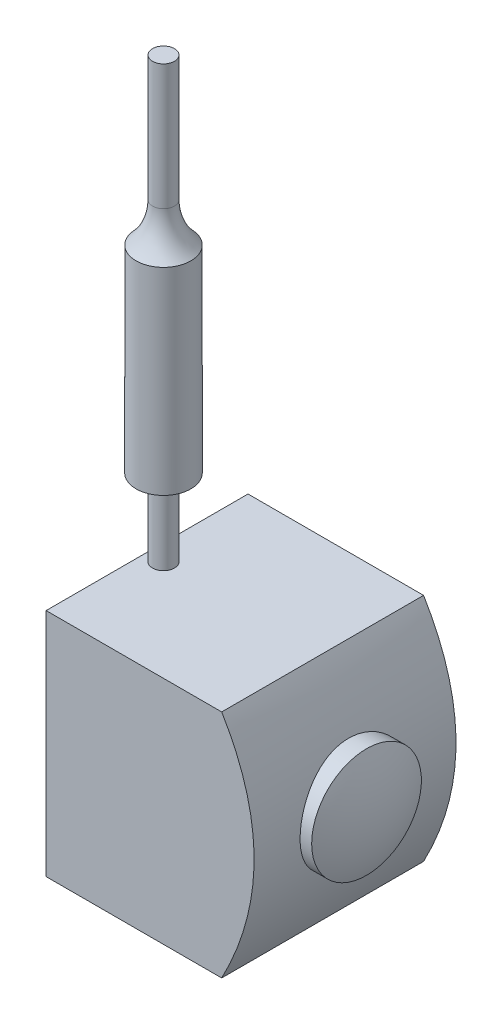
ISO-10303-21;
HEADER;
FILE_DESCRIPTION(('STEP AP214'),'2;1');
FILE_NAME('part.step','',(''),(''),'','','');
FILE_SCHEMA(('AUTOMOTIVE_DESIGN { 1 0 10303 214 1 1 1 1 }'));
ENDSEC;
DATA;
#1=APPLICATION_CONTEXT('core data for automotive mechanical design processes');
#2=APPLICATION_PROTOCOL_DEFINITION('international standard','automotive_design',2000,#1);
#3=PRODUCT_CONTEXT('',#1,'mechanical');
#4=PRODUCT('Part','Part','',(#3));
#5=PRODUCT_RELATED_PRODUCT_CATEGORY('part','',(#4));
#6=PRODUCT_DEFINITION_FORMATION('','',#4);
#7=PRODUCT_DEFINITION_CONTEXT('part definition',#1,'design');
#8=PRODUCT_DEFINITION('design','',#6,#7);
#9=PRODUCT_DEFINITION_SHAPE('','',#8);
#10=(LENGTH_UNIT() NAMED_UNIT(*) SI_UNIT(.MILLI.,.METRE.));
#11=(NAMED_UNIT(*) PLANE_ANGLE_UNIT() SI_UNIT($,.RADIAN.));
#12=(NAMED_UNIT(*) SI_UNIT($,.STERADIAN.) SOLID_ANGLE_UNIT());
#13=UNCERTAINTY_MEASURE_WITH_UNIT(LENGTH_MEASURE(1.E-05),#10,'distance_accuracy_value','');
#14=(GEOMETRIC_REPRESENTATION_CONTEXT(3) GLOBAL_UNCERTAINTY_ASSIGNED_CONTEXT((#13)) GLOBAL_UNIT_ASSIGNED_CONTEXT((#10,
#11,#12)) REPRESENTATION_CONTEXT('',''));
#15=CARTESIAN_POINT('',(0.,0.,0.));
#16=DIRECTION('',(0.,0.,1.));
#17=DIRECTION('',(1.,0.,0.));
#18=AXIS2_PLACEMENT_3D('',#15,#16,#17);
#19=CARTESIAN_POINT('',(-16.0675074987502,49.911673050458,9.2));
#20=DIRECTION('',(0.,-1.,0.));
#21=DIRECTION('',(0.,0.,-1.));
#22=AXIS2_PLACEMENT_3D('',#19,#20,#21);
#23=CYLINDRICAL_SURFACE('',#22,1.);
#24=CARTESIAN_POINT('',(-16.0675074987502,9.91167305045797,9.2));
#25=DIRECTION('',(0.,-1.,0.));
#26=DIRECTION('',(0.,0.,-1.));
#27=AXIS2_PLACEMENT_3D('',#24,#25,#26);
#28=CIRCLE('',#27,1.);
#29=CARTESIAN_POINT('',(-16.0675074987502,9.91167305045797,8.2));
#30=VERTEX_POINT('',#29);
#31=EDGE_CURVE('E183',#30,#30,#28,.F.);
#32=ORIENTED_EDGE('',*,*,#31,.T.);
#33=EDGE_LOOP('',(#32));
#34=FACE_BOUND('',#33,.T.);
#35=CARTESIAN_POINT('',(-16.0675074987502,16.911673050458,9.2));
#36=DIRECTION('',(0.,1.,0.));
#37=DIRECTION('',(0.,0.,1.));
#38=AXIS2_PLACEMENT_3D('',#35,#36,#37);
#39=CIRCLE('',#38,1.);
#40=CARTESIAN_POINT('',(-16.0675074987502,16.911673050458,10.2));
#41=VERTEX_POINT('',#40);
#42=EDGE_CURVE('E42',#41,#41,#39,.T.);
#43=ORIENTED_EDGE('',*,*,#42,.F.);
#44=EDGE_LOOP('',(#43));
#45=FACE_BOUND('',#44,.T.);
#46=ADVANCED_FACE('F33',(#34,#45),#23,.T.);
#47=CARTESIAN_POINT('',(-17.5638837182943,9.91167305045797,18.4));
#48=DIRECTION('',(1.,0.,0.));
#49=DIRECTION('',(0.,0.,-1.));
#50=AXIS2_PLACEMENT_3D('',#47,#48,#49);
#51=PLANE('',#50);
#52=DIRECTION('',(0.,-1.,0.));
#53=VECTOR('',#52,1.);
#54=CARTESIAN_POINT('',(-17.5638837182943,9.91167305045797,0.));
#55=LINE('',#54,#53);
#56=CARTESIAN_POINT('',(-17.5638837182943,9.91167305045797,0.));
#57=VERTEX_POINT('',#56);
#58=CARTESIAN_POINT('',(-17.5638837182943,-11.088326949542,0.));
#59=VERTEX_POINT('',#58);
#60=EDGE_CURVE('E125',#57,#59,#55,.T.);
#61=ORIENTED_EDGE('',*,*,#60,.T.);
#62=DIRECTION('',(0.,0.,-1.));
#63=VECTOR('',#62,1.);
#64=CARTESIAN_POINT('',(-17.5638837182943,-11.088326949542,18.4));
#65=LINE('',#64,#63);
#66=CARTESIAN_POINT('',(-17.5638837182943,-11.088326949542,18.4));
#67=VERTEX_POINT('',#66);
#68=EDGE_CURVE('E92',#67,#59,#65,.T.);
#69=ORIENTED_EDGE('',*,*,#68,.F.);
#70=DIRECTION('',(0.,-1.,0.));
#71=VECTOR('',#70,1.);
#72=CARTESIAN_POINT('',(-17.5638837182943,9.91167305045797,18.4));
#73=LINE('',#72,#71);
#74=CARTESIAN_POINT('',(-17.5638837182943,9.91167305045797,18.4));
#75=VERTEX_POINT('',#74);
#76=EDGE_CURVE('E86',#75,#67,#73,.T.);
#77=ORIENTED_EDGE('',*,*,#76,.F.);
#78=DIRECTION('',(0.,0.,-1.));
#79=VECTOR('',#78,1.);
#80=CARTESIAN_POINT('',(-17.5638837182943,9.91167305045797,18.4));
#81=LINE('',#80,#79);
#82=EDGE_CURVE('E97',#75,#57,#81,.T.);
#83=ORIENTED_EDGE('',*,*,#82,.T.);
#84=EDGE_LOOP('',(#61,#69,#77,#83));
#85=FACE_BOUND('',#84,.T.);
#86=ADVANCED_FACE('F145',(#85),#51,.F.);
#87=CARTESIAN_POINT('',(-17.5638837182943,-11.088326949542,18.4));
#88=DIRECTION('',(0.,1.,0.));
#89=DIRECTION('',(0.,0.,1.));
#90=AXIS2_PLACEMENT_3D('',#87,#88,#89);
#91=PLANE('',#90);
#92=DIRECTION('',(1.,0.,0.));
#93=VECTOR('',#92,1.);
#94=CARTESIAN_POINT('',(-17.5638837182943,-11.088326949542,0.));
#95=LINE('',#94,#93);
#96=CARTESIAN_POINT('',(-1.56388371829431,-11.088326949542,0.));
#97=VERTEX_POINT('',#96);
#98=EDGE_CURVE('E91',#59,#97,#95,.T.);
#99=ORIENTED_EDGE('',*,*,#98,.T.);
#100=DIRECTION('',(0.,0.,-1.));
#101=VECTOR('',#100,1.);
#102=CARTESIAN_POINT('',(-1.56388371829431,-11.088326949542,18.4));
#103=LINE('',#102,#101);
#104=CARTESIAN_POINT('',(-1.56388371829431,-11.088326949542,18.4));
#105=VERTEX_POINT('',#104);
#106=EDGE_CURVE('E89',#105,#97,#103,.T.);
#107=ORIENTED_EDGE('',*,*,#106,.F.);
#108=DIRECTION('',(1.,0.,0.));
#109=VECTOR('',#108,1.);
#110=CARTESIAN_POINT('',(-17.5638837182943,-11.088326949542,18.4));
#111=LINE('',#110,#109);
#112=EDGE_CURVE('E81',#67,#105,#111,.T.);
#113=ORIENTED_EDGE('',*,*,#112,.F.);
#114=ORIENTED_EDGE('',*,*,#68,.T.);
#115=EDGE_LOOP('',(#99,#107,#113,#114));
#116=FACE_BOUND('',#115,.T.);
#117=ADVANCED_FACE('F90',(#116),#91,.F.);
#118=CARTESIAN_POINT('',(-1.56388371829431,-11.088326949542,18.4));
#119=CARTESIAN_POINT('',(4.34040420046883,0.119497617881,18.4));
#120=CARTESIAN_POINT('',(-1.56388371829431,9.91167305045797,18.4));
#121=B_SPLINE_CURVE_WITH_KNOTS('',2,(#118,#119,#120),.UNSPECIFIED.,.F.,.F.,(3,3),(0.,1.),.UNSPECIFIED.);
#122=DIRECTION('',(0.,0.,-1.));
#123=VECTOR('',#122,1.);
#124=SURFACE_OF_LINEAR_EXTRUSION('',#121,#123);
#125=CARTESIAN_POINT('',(1.3849139394261,-0.588326949542032,14.2));
#126=CARTESIAN_POINT('',(1.38751193288624,-0.450951628933767,14.200004750296));
#127=CARTESIAN_POINT('',(1.38859537713313,-0.313596712362414,14.1943378815387));
#128=CARTESIAN_POINT('',(1.38774661549154,-0.0397912858324787,14.1717161647402));
#129=CARTESIAN_POINT('',(1.38581415286268,0.0966591461353914,14.1547603557559));
#130=CARTESIAN_POINT('',(1.3790133844704,0.367648849301643,14.1096830681921));
#131=CARTESIAN_POINT('',(1.37414448909772,0.502187731123377,14.0815593475839));
#132=CARTESIAN_POINT('',(1.36163953083277,0.76842344222715,14.0143621489319));
#133=CARTESIAN_POINT('',(1.35400245670791,0.900119214251678,13.9752846705976));
#134=CARTESIAN_POINT('',(1.33622362115779,1.15949662334845,13.886562835834));
#135=CARTESIAN_POINT('',(1.32608575275919,1.28718415510951,13.8369349198783));
#136=CARTESIAN_POINT('',(1.30361198495189,1.53794167734414,13.727439526037));
#137=CARTESIAN_POINT('',(1.29127527175732,1.66100993775493,13.6675682574472));
#138=CARTESIAN_POINT('',(1.26478306997926,1.90164225431375,13.5380536842958));
#139=CARTESIAN_POINT('',(1.25062817525614,2.01920809065012,13.4684135697855));
#140=CARTESIAN_POINT('',(1.22091636116953,2.24814712900406,13.3198380200431));
#141=CARTESIAN_POINT('',(1.20535890621961,2.35951793889285,13.2408990303523));
#142=CARTESIAN_POINT('',(1.15665844309365,2.6872715112204,12.9878055861234));
#143=CARTESIAN_POINT('',(1.12199378041174,2.89291946880274,12.7997291937157));
#144=CARTESIAN_POINT('',(1.05278985058357,3.27018765881495,12.3920237517829));
#145=CARTESIAN_POINT('',(1.01825060026145,3.44180348017032,12.1723906183858));
#146=CARTESIAN_POINT('',(0.96929783232623,3.67171985754377,11.821477861909));
#147=CARTESIAN_POINT('',(0.953311186840744,3.74435749555521,11.699598305495));
#148=CARTESIAN_POINT('',(0.922930150579205,3.87907886122133,11.4499713075473));
#149=CARTESIAN_POINT('',(0.908535147072376,3.94116665520095,11.3222261510728));
#150=CARTESIAN_POINT('',(0.881792693358782,4.05432748238578,11.0617041192945));
#151=CARTESIAN_POINT('',(0.869445815409827,4.10539743833898,10.9289258503988));
#152=CARTESIAN_POINT('',(0.847208536433337,4.19607058748352,10.6593659780344));
#153=CARTESIAN_POINT('',(0.837317115581163,4.23567854232283,10.5225860630434));
#154=CARTESIAN_POINT('',(0.820465864737982,4.30249899513557,10.2485016268679));
#155=CARTESIAN_POINT('',(0.813455946928314,4.32992401029597,10.1112519803987));
#156=CARTESIAN_POINT('',(0.80234064808168,4.37317402033867,9.83487279173397));
#157=CARTESIAN_POINT('',(0.798234144191286,4.38900349971258,9.69574399750943));
#158=CARTESIAN_POINT('',(0.793055063718353,4.40893956629561,9.41658695367963));
#159=CARTESIAN_POINT('',(0.791982607533465,4.41304568829631,9.27655866860159));
#160=CARTESIAN_POINT('',(0.792907154255712,4.40949673775882,8.9966625818175));
#161=CARTESIAN_POINT('',(0.794904110380928,4.40184184447413,8.85679477769803));
#162=CARTESIAN_POINT('',(0.801811885701065,4.37518704495356,8.58184589449469));
#163=CARTESIAN_POINT('',(0.806646634600916,4.35648323636362,8.44673407065569));
#164=CARTESIAN_POINT('',(0.819020353843218,4.3081244735248,8.1785631525819));
#165=CARTESIAN_POINT('',(0.826560252399087,4.27846576023483,8.04550477930958));
#166=CARTESIAN_POINT('',(0.844111063775801,4.20844948191914,7.78244711579672));
#167=CARTESIAN_POINT('',(0.854121208741912,4.16809524121764,7.6524468886859));
#168=CARTESIAN_POINT('',(0.876316654019426,4.07698099719394,7.39628451281612));
#169=CARTESIAN_POINT('',(0.888502770055795,4.02621709044804,7.2701238242494));
#170=CARTESIAN_POINT('',(0.914812439203032,3.91413406668307,7.02132162382874));
#171=CARTESIAN_POINT('',(0.928953458241191,3.85271835651603,6.89872548678608));
#172=CARTESIAN_POINT('',(0.958667192594097,3.72009313654841,6.65907921001706));
#173=CARTESIAN_POINT('',(0.974240399998968,3.64888025630762,6.54203099761048));
#174=CARTESIAN_POINT('',(1.00635789489433,3.49716495683691,6.31426270720123));
#175=CARTESIAN_POINT('',(1.02290217113865,3.41666264517954,6.20354255594117));
#176=CARTESIAN_POINT('',(1.05648250527687,3.24689499758296,5.98911638857227));
#177=CARTESIAN_POINT('',(1.07351857231335,3.15762949865819,5.88541050298161));
#178=CARTESIAN_POINT('',(1.1080919488153,2.96815825153117,5.68272576775675));
#179=CARTESIAN_POINT('',(1.12562928969338,2.8677082474764,5.58397509528771));
#180=CARTESIAN_POINT('',(1.16016315062309,2.65882132293705,5.39528832562237));
#181=CARTESIAN_POINT('',(1.17715984968317,2.55038708632222,5.30534928990626));
#182=CARTESIAN_POINT('',(1.21010318538399,2.32616923691756,5.13483626458702));
#183=CARTESIAN_POINT('',(1.22604940778571,2.2103827598158,5.05426595992693));
#184=CARTESIAN_POINT('',(1.25638204881485,1.97231561068973,4.9031430127962));
#185=CARTESIAN_POINT('',(1.2707690786988,1.85003751181673,4.83258644121854));
#186=CARTESIAN_POINT('',(1.29755417759936,1.59959350971659,4.70189113346595));
#187=CARTESIAN_POINT('',(1.30994930824741,1.47141926054566,4.64176777770229));
#188=CARTESIAN_POINT('',(1.3323171107722,1.21030067046364,4.53256414943073));
#189=CARTESIAN_POINT('',(1.34229070759805,1.07735817321257,4.48347966095551));
#190=CARTESIAN_POINT('',(1.3594865734931,0.807621664247089,4.39673048510055));
#191=CARTESIAN_POINT('',(1.366708826595,0.670827630185383,4.35906586399581));
#192=CARTESIAN_POINT('',(1.37814758289598,0.394414545880766,4.29547868290691));
#193=CARTESIAN_POINT('',(1.38236416751582,0.25479557226821,4.2695558048568));
#194=CARTESIAN_POINT('',(1.38755225598535,-0.0220749391987331,4.230258303718));
#195=CARTESIAN_POINT('',(1.38861532042232,-0.159275788070988,4.21653790482735));
#196=CARTESIAN_POINT('',(1.38769662984821,-0.434380617909118,4.20047086384266));
#197=CARTESIAN_POINT('',(1.38571382209234,-0.572284825555818,4.19812815538449));
#198=CARTESIAN_POINT('',(1.37873159064836,-0.847678790255171,4.20483226358066));
#199=CARTESIAN_POINT('',(1.3737334649165,-0.985168700066686,4.21387418149434));
#200=CARTESIAN_POINT('',(1.36083489877219,-1.2588498067519,4.24325235070042));
#201=CARTESIAN_POINT('',(1.35293338003139,-1.3950405017878,4.2635927997373));
#202=CARTESIAN_POINT('',(1.33454108105489,-1.66341369058503,4.31506153973982));
#203=CARTESIAN_POINT('',(1.32408389590401,-1.79562500591889,4.34605182595442));
#204=CARTESIAN_POINT('',(1.30078633599314,-2.05694276904108,4.41862332578519));
#205=CARTESIAN_POINT('',(1.28794510428788,-2.18604808146798,4.46020834968602));
#206=CARTESIAN_POINT('',(1.26020299539296,-2.44022839088687,4.55362608055791));
#207=CARTESIAN_POINT('',(1.24530263328965,-2.56530438618394,4.60545622612839));
#208=CARTESIAN_POINT('',(1.21379931521383,-2.81071145864754,4.71900746732016));
#209=CARTESIAN_POINT('',(1.19719575416985,-2.93104082838177,4.78073208242247));
#210=CARTESIAN_POINT('',(1.16227229022807,-3.16902889120018,4.91524658097314));
#211=CARTESIAN_POINT('',(1.14392046554985,-3.28655145629636,4.98826907042338));
#212=CARTESIAN_POINT('',(1.10631681221562,-3.51504907123483,5.14372177215712));
#213=CARTESIAN_POINT('',(1.0870649622566,-3.62602396595728,5.22615220718714));
#214=CARTESIAN_POINT('',(1.04813390198471,-3.84076266471141,5.39990219093661));
#215=CARTESIAN_POINT('',(1.02845455437567,-3.94452410573501,5.49122462923022));
#216=CARTESIAN_POINT('',(0.989168601661483,-4.14410644276179,5.68211785849593));
#217=CARTESIAN_POINT('',(0.969561974716494,-4.23992994493364,5.78168592063965));
#218=CARTESIAN_POINT('',(0.930390296435816,-4.42547339111711,5.99119969478552));
#219=CARTESIAN_POINT('',(0.910839965153389,-4.51496585760673,6.10134977901954));
#220=CARTESIAN_POINT('',(0.872840725137541,-4.6843151071582,6.32893875662335));
#221=CARTESIAN_POINT('',(0.854391413811069,-4.76417542330263,6.4463749533562));
#222=CARTESIAN_POINT('',(0.819069606548532,-4.91373868222549,6.68783214297935));
#223=CARTESIAN_POINT('',(0.802197660770964,-4.98343808575476,6.81185540985312));
#224=CARTESIAN_POINT('',(0.770499425723745,-5.11207988209341,7.06554978992727));
#225=CARTESIAN_POINT('',(0.755672300003903,-5.17102667654765,7.19521856505731));
#226=CARTESIAN_POINT('',(0.728597867495937,-5.27718543567733,7.45802145938086));
#227=CARTESIAN_POINT('',(0.716326355547497,-5.32450834398582,7.59110825058879));
#228=CARTESIAN_POINT('',(0.694519621342393,-5.4077576419678,7.86096406219732));
#229=CARTESIAN_POINT('',(0.684983329782241,-5.44368848582075,7.99773162070811));
#230=CARTESIAN_POINT('',(0.668906206221569,-5.50386231658547,8.27398886178258));
#231=CARTESIAN_POINT('',(0.662365373257177,-5.52810530725813,8.41347854347033));
#232=CARTESIAN_POINT('',(0.652463983356088,-5.56468203459165,8.6941215395784));
#233=CARTESIAN_POINT('',(0.649103343863502,-5.57701608040163,8.83527481071664));
#234=CARTESIAN_POINT('',(0.645712663148422,-5.58945887181799,9.11362006581107));
#235=CARTESIAN_POINT('',(0.645579307670672,-5.5899468444877,9.25079398232318));
#236=CARTESIAN_POINT('',(0.648384948964119,-5.57965346616562,9.52473500094911));
#237=CARTESIAN_POINT('',(0.651325002566706,-5.56886823873859,9.66150194689817));
#238=CARTESIAN_POINT('',(0.660198834130391,-5.53612326608103,9.9335346170553));
#239=CARTESIAN_POINT('',(0.666131383509424,-5.5141681066825,10.0688009340801));
#240=CARTESIAN_POINT('',(0.680835230431819,-5.45926342962675,10.3369777001417));
#241=CARTESIAN_POINT('',(0.689607587247987,-5.42630980930582,10.4698872505408));
#242=CARTESIAN_POINT('',(0.709685258195021,-5.34997127809225,10.7313908293246));
#243=CARTESIAN_POINT('',(0.720971115873202,-5.30666631540089,10.8600097181614));
#244=CARTESIAN_POINT('',(0.745830526732234,-5.20982017668771,11.1131579433737));
#245=CARTESIAN_POINT('',(0.759404918454112,-5.15627524767351,11.2376857606847));
#246=CARTESIAN_POINT('',(0.788496158975108,-5.03937515043433,11.4817704726317));
#247=CARTESIAN_POINT('',(0.804012519018669,-4.97602244968695,11.6013286079894));
#248=CARTESIAN_POINT('',(0.836615747269735,-4.83992416258278,11.8348029846953));
#249=CARTESIAN_POINT('',(0.853703173033953,-4.7671752378565,11.948717200826));
#250=CARTESIAN_POINT('',(0.889512245900215,-4.61069289566551,12.1731792087114));
#251=CARTESIAN_POINT('',(0.908265693515843,-4.52671460577303,12.2835512686447));
#252=CARTESIAN_POINT('',(0.946518481225508,-4.34995521260398,12.4968683760718));
#253=CARTESIAN_POINT('',(0.966017838109317,-4.25717391110958,12.5998132562354));
#254=CARTESIAN_POINT('',(1.00528415737465,-4.06337677598721,12.7976676251476));
#255=CARTESIAN_POINT('',(1.02505122895386,-3.96235749233023,12.8925737130136));
#256=CARTESIAN_POINT('',(1.06434613237434,-3.75280070503484,13.0736645559718));
#257=CARTESIAN_POINT('',(1.0838740418432,-3.64426572128975,13.1598522105923));
#258=CARTESIAN_POINT('',(1.12268135610533,-3.41757996646914,13.3249810645793));
#259=CARTESIAN_POINT('',(1.14194289025968,-3.29925854095157,13.4036924148239));
#260=CARTESIAN_POINT('',(1.17919540791758,-3.05624445925267,13.5508106092498));
#261=CARTESIAN_POINT('',(1.19718684900896,-2.93155412584897,13.6192211747552));
#262=CARTESIAN_POINT('',(1.23142151633414,-2.67663745758956,13.745234958166));
#263=CARTESIAN_POINT('',(1.24766531181983,-2.54641294475231,13.8028416997184));
#264=CARTESIAN_POINT('',(1.27796992323169,-2.28134883734128,13.9067990678855));
#265=CARTESIAN_POINT('',(1.29203107426516,-2.14650995511157,13.9531514230342));
#266=CARTESIAN_POINT('',(1.32628098744008,-1.78005667972375,14.0618019200736));
#267=CARTESIAN_POINT('',(1.34413460920382,-1.54498470280278,14.1135097240873));
#268=CARTESIAN_POINT('',(1.37117655201538,-1.06936283848207,14.1826024921471));
#269=CARTESIAN_POINT('',(1.38036594041733,-0.828813629567265,14.1999916842203));
#270=CARTESIAN_POINT('',(1.3849139394261,-0.588326949542032,14.2));
#271=B_SPLINE_CURVE_WITH_KNOTS('',3,(#125,#126,#127,#128,#129,#130,#131,#132,#133,#134,#135,
#136,#137,#138,#139,#140,#141,#142,#143,#144,#145,#146,#147,#148,#149,#150,#151,#152,#153,#154,
#155,#156,#157,#158,#159,#160,#161,#162,#163,#164,#165,#166,#167,#168,#169,#170,#171,#172,#173,
#174,#175,#176,#177,#178,#179,#180,#181,#182,#183,#184,#185,#186,#187,#188,#189,#190,#191,#192,
#193,#194,#195,#196,#197,#198,#199,#200,#201,#202,#203,#204,#205,#206,#207,#208,#209,#210,#211,
#212,#213,#214,#215,#216,#217,#218,#219,#220,#221,#222,#223,#224,#225,#226,#227,#228,#229,#230,
#231,#232,#233,#234,#235,#236,#237,#238,#239,#240,#241,#242,#243,#244,#245,#246,#247,#248,#249,
#250,#251,#252,#253,#254,#255,#256,#257,#258,#259,#260,#261,#262,#263,#264,#265,#266,#267,#268,
#269,#270),.UNSPECIFIED.,.T.,.F.,(4,2,2,2,2,2,2,2,2,2,2,2,2,2,2,2,2,2,2,2,2,2,2,2,2,2,2,2,2,2,2,
2,2,2,2,2,2,2,2,2,2,2,2,2,2,2,2,2,2,2,2,2,2,2,2,2,2,2,2,2,2,2,2,2,2,2,2,2,2,2,2,2,4),(0.,
0.411989760417144,0.824014594921961,1.23612218786298,1.64838047819912,2.06000100523848,
2.47177418932797,2.88341321909891,3.29521011000405,4.13360677848893,4.97211204481165,
5.40001836504488,5.82775937736574,6.25561970236076,6.68330202575196,7.10319898424811,
7.52293346469909,7.94268460089882,8.36242933959732,8.77140541801105,9.18052196211468,
9.58951149571162,9.99865467385335,10.4117231296299,10.8249340469764,11.238140179779,
11.6513539992142,12.0766996205443,12.5019029105924,12.9272728814368,13.3524754848962,
13.7782996835415,14.2039609740576,14.629624734844,15.0552769643571,15.4684434394178,
15.8817527493388,16.2948842753525,16.7081693949285,17.116289235943,17.524556060618,
17.932720942606,18.341031333077,18.7592721596198,19.1775228906655,19.5959099943365,
20.0141591850082,20.443433604565,20.8725500838584,21.3018156776947,21.7309051528052,
22.1557244581089,22.5803774580349,23.0050303213169,23.4296721605663,23.8407014156076,
24.2518720548713,24.6628740234814,25.0740294763808,25.4821065365957,25.890333446462,
26.2984578194087,26.7067275951488,27.1260974748203,27.5454767997061,27.965032669695,
28.3844485441647,28.8141611927425,29.2437182263225,29.6731349161077,30.1024856110401,
30.8237960899191,31.545017698345),.UNSPECIFIED.);
#272=CARTESIAN_POINT('',(1.3849139394261,-0.588326949542032,14.2));
#273=VERTEX_POINT('',#272);
#274=EDGE_CURVE('E117',#273,#273,#271,.T.);
#275=ORIENTED_EDGE('',*,*,#274,.T.);
#276=EDGE_LOOP('',(#275));
#277=FACE_BOUND('',#276,.T.);
#278=CARTESIAN_POINT('',(-1.56388371829431,-11.088326949542,0.));
#279=CARTESIAN_POINT('',(4.34040420046883,0.119497617881,0.));
#280=CARTESIAN_POINT('',(-1.56388371829431,9.91167305045797,0.));
#281=B_SPLINE_CURVE_WITH_KNOTS('',2,(#278,#279,#280),.UNSPECIFIED.,.F.,.F.,(3,3),(0.,1.),.UNSPECIFIED.);
#282=CARTESIAN_POINT('',(-1.56388371829431,9.91167305045797,0.));
#283=VERTEX_POINT('',#282);
#284=EDGE_CURVE('E67',#97,#283,#281,.T.);
#285=ORIENTED_EDGE('',*,*,#284,.T.);
#286=DIRECTION('',(0.,0.,-1.));
#287=VECTOR('',#286,1.);
#288=CARTESIAN_POINT('',(-1.56388371829431,9.91167305045797,18.4));
#289=LINE('',#288,#287);
#290=CARTESIAN_POINT('',(-1.56388371829431,9.91167305045797,18.4));
#291=VERTEX_POINT('',#290);
#292=EDGE_CURVE('E93',#291,#283,#289,.T.);
#293=ORIENTED_EDGE('',*,*,#292,.F.);
#294=EDGE_CURVE('E84',#105,#291,#121,.T.);
#295=ORIENTED_EDGE('',*,*,#294,.F.);
#296=ORIENTED_EDGE('',*,*,#106,.T.);
#297=EDGE_LOOP('',(#285,#293,#295,#296));
#298=FACE_BOUND('',#297,.T.);
#299=ADVANCED_FACE('F95',(#277,#298),#124,.F.);
#300=CARTESIAN_POINT('',(-17.5638837182943,9.91167305045797,18.4));
#301=DIRECTION('',(0.,-1.,0.));
#302=DIRECTION('',(0.,0.,-1.));
#303=AXIS2_PLACEMENT_3D('',#300,#301,#302);
#304=PLANE('',#303);
#305=ORIENTED_EDGE('',*,*,#31,.F.);
#306=EDGE_LOOP('',(#305));
#307=FACE_BOUND('',#306,.T.);
#308=DIRECTION('',(-1.,0.,0.));
#309=VECTOR('',#308,1.);
#310=CARTESIAN_POINT('',(-17.5638837182943,9.91167305045797,0.));
#311=LINE('',#310,#309);
#312=EDGE_CURVE('E73',#283,#57,#311,.T.);
#313=ORIENTED_EDGE('',*,*,#312,.T.);
#314=ORIENTED_EDGE('',*,*,#82,.F.);
#315=DIRECTION('',(-1.,0.,0.));
#316=VECTOR('',#315,1.);
#317=CARTESIAN_POINT('',(-17.5638837182943,9.91167305045797,18.4));
#318=LINE('',#317,#316);
#319=EDGE_CURVE('E50',#291,#75,#318,.T.);
#320=ORIENTED_EDGE('',*,*,#319,.F.);
#321=ORIENTED_EDGE('',*,*,#292,.T.);
#322=EDGE_LOOP('',(#313,#314,#320,#321));
#323=FACE_BOUND('',#322,.T.);
#324=ADVANCED_FACE('F112',(#307,#323),#304,.F.);
#325=CARTESIAN_POINT('',(1.38826024108726,-0.234414665830519,18.4));
#326=DIRECTION('',(0.,0.,1.));
#327=DIRECTION('',(1.,0.,0.));
#328=AXIS2_PLACEMENT_3D('',#325,#326,#327);
#329=PLANE('',#328);
#330=ORIENTED_EDGE('',*,*,#76,.T.);
#331=ORIENTED_EDGE('',*,*,#112,.T.);
#332=ORIENTED_EDGE('',*,*,#294,.T.);
#333=ORIENTED_EDGE('',*,*,#319,.T.);
#334=EDGE_LOOP('',(#330,#331,#332,#333));
#335=FACE_BOUND('',#334,.T.);
#336=ADVANCED_FACE('F82',(#335),#329,.T.);
#337=CARTESIAN_POINT('',(1.38826024108726,-0.234414665830519,0.));
#338=DIRECTION('',(0.,0.,1.));
#339=DIRECTION('',(1.,0.,0.));
#340=AXIS2_PLACEMENT_3D('',#337,#338,#339);
#341=PLANE('',#340);
#342=ORIENTED_EDGE('',*,*,#60,.F.);
#343=ORIENTED_EDGE('',*,*,#312,.F.);
#344=ORIENTED_EDGE('',*,*,#284,.F.);
#345=ORIENTED_EDGE('',*,*,#98,.F.);
#346=EDGE_LOOP('',(#342,#343,#344,#345));
#347=FACE_BOUND('',#346,.T.);
#348=ADVANCED_FACE('F134',(#347),#341,.F.);
#349=CARTESIAN_POINT('',(2.43611628170569,-0.588326949542032,9.2));
#350=DIRECTION('',(-1.,0.,0.));
#351=DIRECTION('',(0.,0.,1.));
#352=AXIS2_PLACEMENT_3D('',#349,#350,#351);
#353=CYLINDRICAL_SURFACE('',#352,5.);
#354=CARTESIAN_POINT('',(2.43611628170569,-0.588326949542032,9.2));
#355=DIRECTION('',(-1.,0.,0.));
#356=DIRECTION('',(0.,0.,1.));
#357=AXIS2_PLACEMENT_3D('',#354,#355,#356);
#358=CIRCLE('',#357,5.);
#359=CARTESIAN_POINT('',(2.43611628170569,-0.588326949542032,14.2));
#360=VERTEX_POINT('',#359);
#361=EDGE_CURVE('E126',#360,#360,#358,.T.);
#362=ORIENTED_EDGE('',*,*,#361,.T.);
#363=EDGE_LOOP('',(#362));
#364=FACE_BOUND('',#363,.T.);
#365=ORIENTED_EDGE('',*,*,#274,.F.);
#366=EDGE_LOOP('',(#365));
#367=FACE_BOUND('',#366,.T.);
#368=ADVANCED_FACE('F128',(#364,#367),#353,.T.);
#369=CARTESIAN_POINT('',(-9.56388371829432,-0.588326949542032,9.2));
#370=DIRECTION('',(0.,0.,1.));
#371=DIRECTION('',(1.,0.,0.));
#372=AXIS2_PLACEMENT_3D('',#369,#370,#371);
#373=SPHERICAL_SURFACE('',#372,13.);
#374=CARTESIAN_POINT('',(-9.56388371829432,-0.588326949542032,9.2));
#375=DIRECTION('',(-1.,0.,0.));
#376=DIRECTION('',(0.,0.,1.));
#377=AXIS2_PLACEMENT_3D('',#374,#375,#376);
#378=SPHERICAL_SURFACE('',#377,13.);
#379=ORIENTED_EDGE('',*,*,#361,.F.);
#380=EDGE_LOOP('',(#379));
#381=FACE_BOUND('',#380,.T.);
#382=ADVANCED_FACE('F133',(#381),#378,.T.);
#383=CARTESIAN_POINT('',(-16.0675074987502,16.911673050458,9.2));
#384=DIRECTION('',(0.,1.,0.));
#385=DIRECTION('',(0.,0.,1.));
#386=AXIS2_PLACEMENT_3D('',#383,#384,#385);
#387=CYLINDRICAL_SURFACE('',#386,2.5);
#388=CARTESIAN_POINT('',(-16.0675074987502,16.911673050458,9.2));
#389=DIRECTION('',(0.,1.,0.));
#390=DIRECTION('',(0.,0.,1.));
#391=AXIS2_PLACEMENT_3D('',#388,#389,#390);
#392=CIRCLE('',#391,2.5);
#393=CARTESIAN_POINT('',(-16.0675074987502,16.911673050458,11.7));
#394=VERTEX_POINT('',#393);
#395=EDGE_CURVE('E168',#394,#394,#392,.T.);
#396=ORIENTED_EDGE('',*,*,#395,.T.);
#397=EDGE_LOOP('',(#396));
#398=FACE_BOUND('',#397,.T.);
#399=CARTESIAN_POINT('',(-16.0675074987502,34.911673050458,9.2));
#400=DIRECTION('',(0.,1.,0.));
#401=DIRECTION('',(0.,0.,1.));
#402=AXIS2_PLACEMENT_3D('',#399,#400,#401);
#403=CIRCLE('',#402,2.5);
#404=CARTESIAN_POINT('',(-16.0675074987502,34.911673050458,11.7));
#405=VERTEX_POINT('',#404);
#406=EDGE_CURVE('E172',#405,#405,#403,.T.);
#407=ORIENTED_EDGE('',*,*,#406,.F.);
#408=EDGE_LOOP('',(#407));
#409=FACE_BOUND('',#408,.T.);
#410=ADVANCED_FACE('F190',(#398,#409),#387,.T.);
#411=CARTESIAN_POINT('',(-16.0675074987502,16.911673050458,9.2));
#412=DIRECTION('',(0.,1.,0.));
#413=DIRECTION('',(0.,0.,1.));
#414=AXIS2_PLACEMENT_3D('',#411,#412,#413);
#415=PLANE('',#414);
#416=ORIENTED_EDGE('',*,*,#42,.T.);
#417=EDGE_LOOP('',(#416));
#418=FACE_BOUND('',#417,.T.);
#419=ORIENTED_EDGE('',*,*,#395,.F.);
#420=EDGE_LOOP('',(#419));
#421=FACE_BOUND('',#420,.T.);
#422=ADVANCED_FACE('F161',(#418,#421),#415,.F.);
#423=CARTESIAN_POINT('',(-16.0675074987502,49.911673050458,9.2));
#424=DIRECTION('',(0.,1.,0.));
#425=DIRECTION('',(0.,0.,1.));
#426=AXIS2_PLACEMENT_3D('',#423,#424,#425);
#427=PLANE('',#426);
#428=CARTESIAN_POINT('',(-16.0675074987502,49.911673050458,9.2));
#429=DIRECTION('',(0.,1.,0.));
#430=DIRECTION('',(0.,0.,1.));
#431=AXIS2_PLACEMENT_3D('',#428,#429,#430);
#432=CIRCLE('',#431,1.);
#433=CARTESIAN_POINT('',(-16.0675074987502,49.911673050458,10.2));
#434=VERTEX_POINT('',#433);
#435=EDGE_CURVE('E167',#434,#434,#432,.T.);
#436=ORIENTED_EDGE('',*,*,#435,.T.);
#437=EDGE_LOOP('',(#436));
#438=FACE_BOUND('',#437,.T.);
#439=ADVANCED_FACE('F154',(#438),#427,.T.);
#440=CARTESIAN_POINT('',(-16.0675074987502,38.4823872647294,9.2));
#441=DIRECTION('',(0.,-1.,0.));
#442=DIRECTION('',(0.,0.,-1.));
#443=AXIS2_PLACEMENT_3D('',#440,#441,#442);
#444=CIRCLE('',#443,1.);
#445=CARTESIAN_POINT('',(-16.0675074987502,38.4823872647294,8.2));
#446=VERTEX_POINT('',#445);
#447=EDGE_CURVE('E11',#446,#446,#444,.F.);
#448=ORIENTED_EDGE('',*,*,#447,.T.);
#449=EDGE_LOOP('',(#448));
#450=FACE_BOUND('',#449,.T.);
#451=ORIENTED_EDGE('',*,*,#435,.F.);
#452=EDGE_LOOP('',(#451));
#453=FACE_BOUND('',#452,.T.);
#454=ADVANCED_FACE('F136',(#450,#453),#23,.T.);
#455=CARTESIAN_POINT('',(-16.0675074987502,38.4823872647294,9.2));
#456=DIRECTION('',(0.,-1.,0.));
#457=DIRECTION('',(0.,0.,-1.));
#458=AXIS2_PLACEMENT_3D('',#455,#456,#457);
#459=TOROIDAL_SURFACE('',#458,6.,5.);
#460=ORIENTED_EDGE('',*,*,#406,.T.);
#461=EDGE_LOOP('',(#460));
#462=FACE_BOUND('',#461,.T.);
#463=ORIENTED_EDGE('',*,*,#447,.F.);
#464=EDGE_LOOP('',(#463));
#465=FACE_BOUND('',#464,.T.);
#466=ADVANCED_FACE('F35',(#462,#465),#459,.F.);
#467=CLOSED_SHELL('',(#46,#86,#117,#299,#324,#336,#348,#368,#382,#410,#422,#439,#454,#466));
#468=MANIFOLD_SOLID_BREP('B2',#467);
#469=ADVANCED_BREP_SHAPE_REPRESENTATION('',(#18,#468),#14);
#470=SHAPE_DEFINITION_REPRESENTATION(#9,#469);
ENDSEC;
END-ISO-10303-21;
